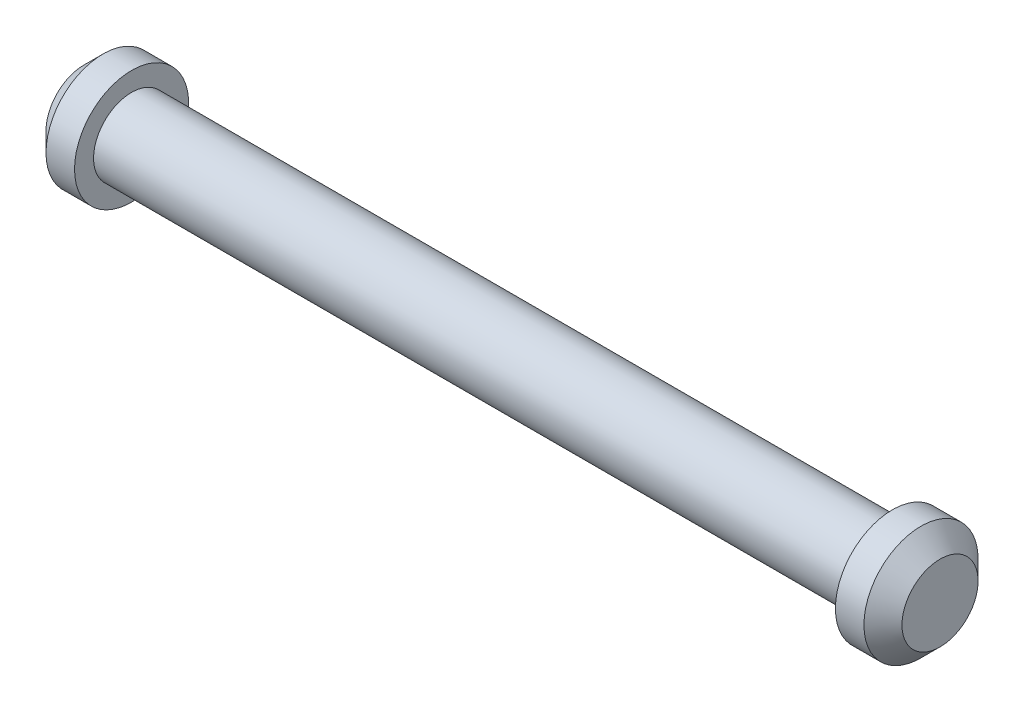
ISO-10303-21;
HEADER;
FILE_DESCRIPTION(('STEP AP214'),'2;1');
FILE_NAME('part.step','',(''),(''),'','','');
FILE_SCHEMA(('AUTOMOTIVE_DESIGN { 1 0 10303 214 1 1 1 1 }'));
ENDSEC;
DATA;
#1=APPLICATION_CONTEXT('core data for automotive mechanical design processes');
#2=APPLICATION_PROTOCOL_DEFINITION('international standard','automotive_design',2000,#1);
#3=PRODUCT_CONTEXT('',#1,'mechanical');
#4=PRODUCT('Part','Part','',(#3));
#5=PRODUCT_RELATED_PRODUCT_CATEGORY('part','',(#4));
#6=PRODUCT_DEFINITION_FORMATION('','',#4);
#7=PRODUCT_DEFINITION_CONTEXT('part definition',#1,'design');
#8=PRODUCT_DEFINITION('design','',#6,#7);
#9=PRODUCT_DEFINITION_SHAPE('','',#8);
#10=(LENGTH_UNIT() NAMED_UNIT(*) SI_UNIT(.MILLI.,.METRE.));
#11=(NAMED_UNIT(*) PLANE_ANGLE_UNIT() SI_UNIT($,.RADIAN.));
#12=(NAMED_UNIT(*) SI_UNIT($,.STERADIAN.) SOLID_ANGLE_UNIT());
#13=UNCERTAINTY_MEASURE_WITH_UNIT(LENGTH_MEASURE(1.E-05),#10,'distance_accuracy_value','');
#14=(GEOMETRIC_REPRESENTATION_CONTEXT(3) GLOBAL_UNCERTAINTY_ASSIGNED_CONTEXT((#13)) GLOBAL_UNIT_ASSIGNED_CONTEXT((#10,
#11,#12)) REPRESENTATION_CONTEXT('',''));
#15=CARTESIAN_POINT('',(0.,0.,0.));
#16=DIRECTION('',(0.,0.,1.));
#17=DIRECTION('',(1.,0.,0.));
#18=AXIS2_PLACEMENT_3D('',#15,#16,#17);
#19=CARTESIAN_POINT('',(45.,0.,0.));
#20=DIRECTION('',(-1.,0.,0.));
#21=DIRECTION('',(0.,0.,1.));
#22=AXIS2_PLACEMENT_3D('',#19,#20,#21);
#23=PLANE('',#22);
#24=CARTESIAN_POINT('',(45.,0.,0.));
#25=DIRECTION('',(-1.,0.,0.));
#26=DIRECTION('',(0.,0.,1.));
#27=AXIS2_PLACEMENT_3D('',#24,#25,#26);
#28=CIRCLE('',#27,4.00000000000001);
#29=CARTESIAN_POINT('',(45.,0.,4.00000000000001));
#30=VERTEX_POINT('',#29);
#31=EDGE_CURVE('E10',#30,#30,#28,.T.);
#32=ORIENTED_EDGE('',*,*,#31,.F.);
#33=EDGE_LOOP('',(#32));
#34=FACE_BOUND('',#33,.T.);
#35=ADVANCED_FACE('F41',(#34),#23,.F.);
#36=CARTESIAN_POINT('',(45.,0.,0.));
#37=DIRECTION('',(-1.,0.,0.));
#38=DIRECTION('',(0.,0.,1.));
#39=AXIS2_PLACEMENT_3D('',#36,#37,#38);
#40=CONICAL_SURFACE('',#39,4.00000000000001,0.785398163397449);
#41=CARTESIAN_POINT('',(43.,0.,0.));
#42=DIRECTION('',(-1.,0.,0.));
#43=DIRECTION('',(0.,0.,1.));
#44=AXIS2_PLACEMENT_3D('',#41,#42,#43);
#45=CIRCLE('',#44,6.);
#46=CARTESIAN_POINT('',(43.,0.,6.));
#47=VERTEX_POINT('',#46);
#48=EDGE_CURVE('E47',#47,#47,#45,.T.);
#49=ORIENTED_EDGE('',*,*,#48,.F.);
#50=EDGE_LOOP('',(#49));
#51=FACE_BOUND('',#50,.T.);
#52=ORIENTED_EDGE('',*,*,#31,.T.);
#53=EDGE_LOOP('',(#52));
#54=FACE_BOUND('',#53,.T.);
#55=ADVANCED_FACE('F107',(#51,#54),#40,.T.);
#56=CARTESIAN_POINT('',(-45.,0.,0.));
#57=DIRECTION('',(-1.,0.,0.));
#58=DIRECTION('',(0.,0.,1.));
#59=AXIS2_PLACEMENT_3D('',#56,#57,#58);
#60=CYLINDRICAL_SURFACE('',#59,6.);
#61=CARTESIAN_POINT('',(40.,0.,0.));
#62=DIRECTION('',(-1.,0.,0.));
#63=DIRECTION('',(0.,0.,1.));
#64=AXIS2_PLACEMENT_3D('',#61,#62,#63);
#65=CIRCLE('',#64,6.);
#66=CARTESIAN_POINT('',(40.,0.,6.));
#67=VERTEX_POINT('',#66);
#68=EDGE_CURVE('E51',#67,#67,#65,.T.);
#69=ORIENTED_EDGE('',*,*,#68,.F.);
#70=EDGE_LOOP('',(#69));
#71=FACE_BOUND('',#70,.T.);
#72=ORIENTED_EDGE('',*,*,#48,.T.);
#73=EDGE_LOOP('',(#72));
#74=FACE_BOUND('',#73,.T.);
#75=ADVANCED_FACE('F102',(#71,#74),#60,.T.);
#76=CARTESIAN_POINT('',(40.,6.,0.));
#77=DIRECTION('',(1.,0.,0.));
#78=DIRECTION('',(0.,0.,-1.));
#79=AXIS2_PLACEMENT_3D('',#76,#77,#78);
#80=PLANE('',#79);
#81=CARTESIAN_POINT('',(40.,0.,0.));
#82=DIRECTION('',(-1.,0.,0.));
#83=DIRECTION('',(0.,0.,1.));
#84=AXIS2_PLACEMENT_3D('',#81,#82,#83);
#85=CIRCLE('',#84,4.);
#86=CARTESIAN_POINT('',(40.,0.,4.));
#87=VERTEX_POINT('',#86);
#88=EDGE_CURVE('E55',#87,#87,#85,.T.);
#89=ORIENTED_EDGE('',*,*,#88,.F.);
#90=EDGE_LOOP('',(#89));
#91=FACE_BOUND('',#90,.T.);
#92=ORIENTED_EDGE('',*,*,#68,.T.);
#93=EDGE_LOOP('',(#92));
#94=FACE_BOUND('',#93,.T.);
#95=ADVANCED_FACE('F96',(#91,#94),#80,.F.);
#96=CARTESIAN_POINT('',(-45.,0.,0.));
#97=DIRECTION('',(-1.,0.,0.));
#98=DIRECTION('',(0.,0.,1.));
#99=AXIS2_PLACEMENT_3D('',#96,#97,#98);
#100=CYLINDRICAL_SURFACE('',#99,4.);
#101=CARTESIAN_POINT('',(-40.,0.,0.));
#102=DIRECTION('',(-1.,0.,0.));
#103=DIRECTION('',(0.,0.,1.));
#104=AXIS2_PLACEMENT_3D('',#101,#102,#103);
#105=CIRCLE('',#104,4.);
#106=CARTESIAN_POINT('',(-40.,0.,4.));
#107=VERTEX_POINT('',#106);
#108=EDGE_CURVE('E60',#107,#107,#105,.T.);
#109=ORIENTED_EDGE('',*,*,#108,.F.);
#110=EDGE_LOOP('',(#109));
#111=FACE_BOUND('',#110,.T.);
#112=ORIENTED_EDGE('',*,*,#88,.T.);
#113=EDGE_LOOP('',(#112));
#114=FACE_BOUND('',#113,.T.);
#115=ADVANCED_FACE('F90',(#111,#114),#100,.T.);
#116=CARTESIAN_POINT('',(-40.,6.,0.));
#117=DIRECTION('',(-1.,0.,0.));
#118=DIRECTION('',(0.,0.,1.));
#119=AXIS2_PLACEMENT_3D('',#116,#117,#118);
#120=PLANE('',#119);
#121=CARTESIAN_POINT('',(-40.,0.,0.));
#122=DIRECTION('',(-1.,0.,0.));
#123=DIRECTION('',(0.,0.,1.));
#124=AXIS2_PLACEMENT_3D('',#121,#122,#123);
#125=CIRCLE('',#124,6.);
#126=CARTESIAN_POINT('',(-40.,0.,6.));
#127=VERTEX_POINT('',#126);
#128=EDGE_CURVE('E63',#127,#127,#125,.T.);
#129=ORIENTED_EDGE('',*,*,#128,.F.);
#130=EDGE_LOOP('',(#129));
#131=FACE_BOUND('',#130,.T.);
#132=ORIENTED_EDGE('',*,*,#108,.T.);
#133=EDGE_LOOP('',(#132));
#134=FACE_BOUND('',#133,.T.);
#135=ADVANCED_FACE('F84',(#131,#134),#120,.F.);
#136=CARTESIAN_POINT('',(-45.,0.,0.));
#137=DIRECTION('',(-1.,0.,0.));
#138=DIRECTION('',(0.,0.,1.));
#139=AXIS2_PLACEMENT_3D('',#136,#137,#138);
#140=CYLINDRICAL_SURFACE('',#139,6.);
#141=CARTESIAN_POINT('',(-43.,0.,0.));
#142=DIRECTION('',(-1.,0.,0.));
#143=DIRECTION('',(0.,0.,1.));
#144=AXIS2_PLACEMENT_3D('',#141,#142,#143);
#145=CIRCLE('',#144,6.);
#146=CARTESIAN_POINT('',(-43.,0.,6.));
#147=VERTEX_POINT('',#146);
#148=EDGE_CURVE('E66',#147,#147,#145,.T.);
#149=ORIENTED_EDGE('',*,*,#148,.F.);
#150=EDGE_LOOP('',(#149));
#151=FACE_BOUND('',#150,.T.);
#152=ORIENTED_EDGE('',*,*,#128,.T.);
#153=EDGE_LOOP('',(#152));
#154=FACE_BOUND('',#153,.T.);
#155=ADVANCED_FACE('F78',(#151,#154),#140,.T.);
#156=CARTESIAN_POINT('',(-43.,0.,0.));
#157=DIRECTION('',(1.,0.,0.));
#158=DIRECTION('',(0.,0.,-1.));
#159=AXIS2_PLACEMENT_3D('',#156,#157,#158);
#160=CONICAL_SURFACE('',#159,6.,0.785398163397448);
#161=CARTESIAN_POINT('',(-45.,0.,0.));
#162=DIRECTION('',(-1.,0.,0.));
#163=DIRECTION('',(0.,0.,1.));
#164=AXIS2_PLACEMENT_3D('',#161,#162,#163);
#165=CIRCLE('',#164,4.);
#166=CARTESIAN_POINT('',(-45.,0.,4.));
#167=VERTEX_POINT('',#166);
#168=EDGE_CURVE('E69',#167,#167,#165,.T.);
#169=ORIENTED_EDGE('',*,*,#168,.F.);
#170=EDGE_LOOP('',(#169));
#171=FACE_BOUND('',#170,.T.);
#172=ORIENTED_EDGE('',*,*,#148,.T.);
#173=EDGE_LOOP('',(#172));
#174=FACE_BOUND('',#173,.T.);
#175=ADVANCED_FACE('F75',(#171,#174),#160,.T.);
#176=CARTESIAN_POINT('',(-45.,0.,0.));
#177=DIRECTION('',(1.,0.,0.));
#178=DIRECTION('',(0.,0.,-1.));
#179=AXIS2_PLACEMENT_3D('',#176,#177,#178);
#180=PLANE('',#179);
#181=ORIENTED_EDGE('',*,*,#168,.T.);
#182=EDGE_LOOP('',(#181));
#183=FACE_BOUND('',#182,.T.);
#184=ADVANCED_FACE('F73',(#183),#180,.F.);
#185=CLOSED_SHELL('',(#35,#55,#75,#95,#115,#135,#155,#175,#184));
#186=MANIFOLD_SOLID_BREP('B2',#185);
#187=ADVANCED_BREP_SHAPE_REPRESENTATION('',(#18,#186),#14);
#188=SHAPE_DEFINITION_REPRESENTATION(#9,#187);
ENDSEC;
END-ISO-10303-21;
